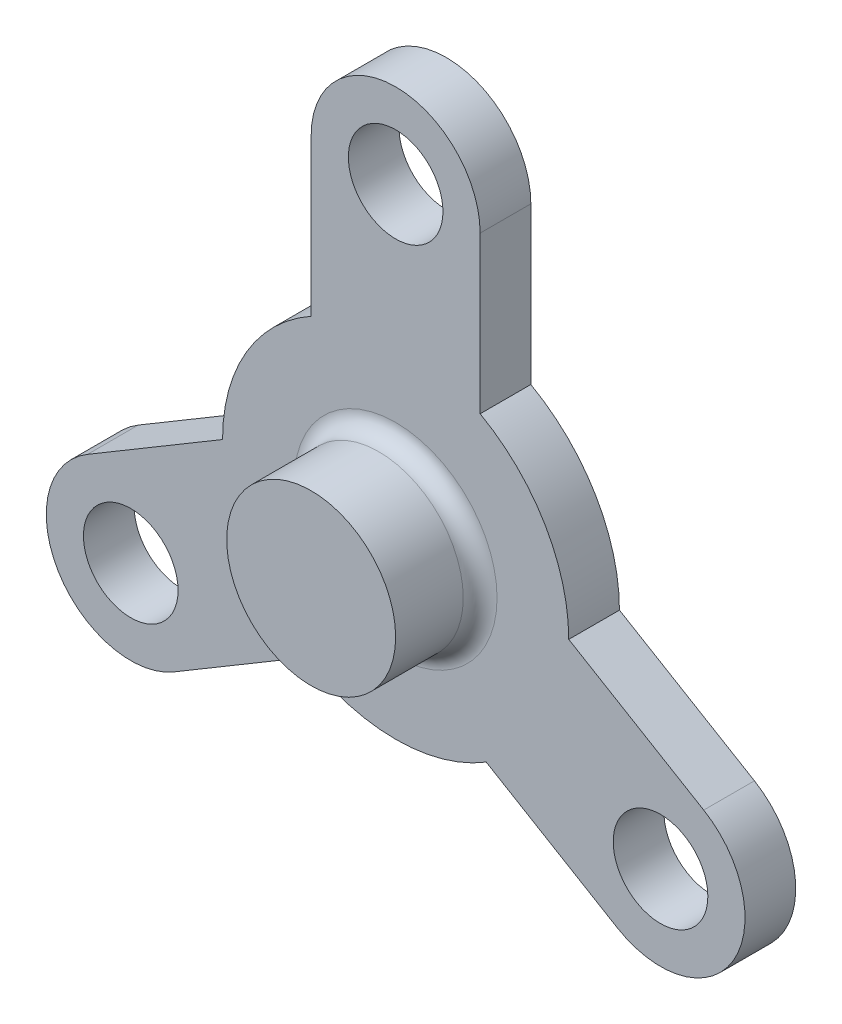
ISO-10303-21;
HEADER;
FILE_DESCRIPTION(('STEP AP214'),'2;1');
FILE_NAME('part.step','',(''),(''),'','','');
FILE_SCHEMA(('AUTOMOTIVE_DESIGN { 1 0 10303 214 1 1 1 1 }'));
ENDSEC;
DATA;
#1=APPLICATION_CONTEXT('core data for automotive mechanical design processes');
#2=APPLICATION_PROTOCOL_DEFINITION('international standard','automotive_design',2000,#1);
#3=PRODUCT_CONTEXT('',#1,'mechanical');
#4=PRODUCT('Part','Part','',(#3));
#5=PRODUCT_RELATED_PRODUCT_CATEGORY('part','',(#4));
#6=PRODUCT_DEFINITION_FORMATION('','',#4);
#7=PRODUCT_DEFINITION_CONTEXT('part definition',#1,'design');
#8=PRODUCT_DEFINITION('design','',#6,#7);
#9=PRODUCT_DEFINITION_SHAPE('','',#8);
#10=(LENGTH_UNIT() NAMED_UNIT(*) SI_UNIT(.MILLI.,.METRE.));
#11=(NAMED_UNIT(*) PLANE_ANGLE_UNIT() SI_UNIT($,.RADIAN.));
#12=(NAMED_UNIT(*) SI_UNIT($,.STERADIAN.) SOLID_ANGLE_UNIT());
#13=UNCERTAINTY_MEASURE_WITH_UNIT(LENGTH_MEASURE(1.E-05),#10,'distance_accuracy_value','');
#14=(GEOMETRIC_REPRESENTATION_CONTEXT(3) GLOBAL_UNCERTAINTY_ASSIGNED_CONTEXT((#13)) GLOBAL_UNIT_ASSIGNED_CONTEXT((#10,
#11,#12)) REPRESENTATION_CONTEXT('',''));
#15=CARTESIAN_POINT('',(0.,0.,0.));
#16=DIRECTION('',(0.,0.,1.));
#17=DIRECTION('',(1.,0.,0.));
#18=AXIS2_PLACEMENT_3D('',#15,#16,#17);
#19=CARTESIAN_POINT('',(-15.6750598084983,-9.05000000000008,3.));
#20=DIRECTION('',(0.,0.,-1.));
#21=DIRECTION('',(-1.,0.,0.));
#22=AXIS2_PLACEMENT_3D('',#19,#20,#21);
#23=CYLINDRICAL_SURFACE('',#22,5.);
#24=CARTESIAN_POINT('',(-15.6750598084983,-9.05000000000008,0.));
#25=DIRECTION('',(0.,0.,1.));
#26=DIRECTION('',(1.,0.,0.));
#27=AXIS2_PLACEMENT_3D('',#24,#25,#26);
#28=CIRCLE('',#27,5.);
#29=CARTESIAN_POINT('',(-18.2317713929619,-4.75311439832654,0.));
#30=VERTEX_POINT('',#29);
#31=CARTESIAN_POINT('',(-13.1183482240346,-13.3468856016736,0.));
#32=VERTEX_POINT('',#31);
#33=EDGE_CURVE('E198',#30,#32,#28,.T.);
#34=ORIENTED_EDGE('',*,*,#33,.T.);
#35=DIRECTION('',(0.,0.,-1.));
#36=VECTOR('',#35,1.);
#37=CARTESIAN_POINT('',(-13.1183482240346,-13.3468856016736,3.));
#38=LINE('',#37,#36);
#39=CARTESIAN_POINT('',(-13.1183482240346,-13.3468856016736,3.));
#40=VERTEX_POINT('',#39);
#41=EDGE_CURVE('E235',#40,#32,#38,.T.);
#42=ORIENTED_EDGE('',*,*,#41,.F.);
#43=CARTESIAN_POINT('',(-15.6750598084983,-9.05000000000008,3.));
#44=DIRECTION('',(0.,0.,1.));
#45=DIRECTION('',(1.,0.,0.));
#46=AXIS2_PLACEMENT_3D('',#43,#44,#45);
#47=CIRCLE('',#46,5.);
#48=CARTESIAN_POINT('',(-18.2317713929619,-4.75311439832654,3.));
#49=VERTEX_POINT('',#48);
#50=EDGE_CURVE('E310',#49,#40,#47,.T.);
#51=ORIENTED_EDGE('',*,*,#50,.F.);
#52=DIRECTION('',(0.,0.,-1.));
#53=VECTOR('',#52,1.);
#54=CARTESIAN_POINT('',(-18.2317713929619,-4.75311439832654,3.));
#55=LINE('',#54,#53);
#56=EDGE_CURVE('E144',#49,#30,#55,.T.);
#57=ORIENTED_EDGE('',*,*,#56,.T.);
#58=EDGE_LOOP('',(#34,#42,#51,#57));
#59=FACE_BOUND('',#58,.T.);
#60=ADVANCED_FACE('F74',(#59),#23,.T.);
#61=CARTESIAN_POINT('',(2.43503335375282,-4.09238954480285,3.));
#62=DIRECTION('',(-0.511342316892728,0.859377120334709,0.));
#63=DIRECTION('',(-0.859377120334709,-0.511342316892728,0.));
#64=AXIS2_PLACEMENT_3D('',#61,#62,#63);
#65=PLANE('',#64);
#66=DIRECTION('',(0.859377120334709,0.511342316892728,0.));
#67=VECTOR('',#66,1.);
#68=CARTESIAN_POINT('',(2.43503335375282,-4.09238954480285,0.));
#69=LINE('',#68,#67);
#70=CARTESIAN_POINT('',(-5.35896242928677,-8.72993430512808,0.));
#71=VERTEX_POINT('',#70);
#72=EDGE_CURVE('E201',#32,#71,#69,.T.);
#73=ORIENTED_EDGE('',*,*,#72,.T.);
#74=DIRECTION('',(0.,0.,-1.));
#75=VECTOR('',#74,1.);
#76=CARTESIAN_POINT('',(-5.35896242928677,-8.72993430512808,3.));
#77=LINE('',#76,#75);
#78=CARTESIAN_POINT('',(-5.35896242928677,-8.72993430512808,3.));
#79=VERTEX_POINT('',#78);
#80=EDGE_CURVE('E232',#79,#71,#77,.T.);
#81=ORIENTED_EDGE('',*,*,#80,.F.);
#82=DIRECTION('',(0.859377120334709,0.511342316892728,0.));
#83=VECTOR('',#82,1.);
#84=CARTESIAN_POINT('',(2.43503335375282,-4.09238954480285,3.));
#85=LINE('',#84,#83);
#86=EDGE_CURVE('E309',#40,#79,#85,.T.);
#87=ORIENTED_EDGE('',*,*,#86,.F.);
#88=ORIENTED_EDGE('',*,*,#41,.T.);
#89=EDGE_LOOP('',(#73,#81,#87,#88));
#90=FACE_BOUND('',#89,.T.);
#91=ADVANCED_FACE('F260',(#90),#65,.F.);
#92=CARTESIAN_POINT('',(0.,0.,3.));
#93=DIRECTION('',(0.,0.,-1.));
#94=DIRECTION('',(-1.,0.,0.));
#95=AXIS2_PLACEMENT_3D('',#92,#93,#94);
#96=CYLINDRICAL_SURFACE('',#95,10.2435458358109);
#97=CARTESIAN_POINT('',(0.,0.,0.));
#98=DIRECTION('',(0.,0.,1.));
#99=DIRECTION('',(1.,0.,0.));
#100=AXIS2_PLACEMENT_3D('',#97,#98,#99);
#101=CIRCLE('',#100,10.2435458358109);
#102=CARTESIAN_POINT('',(5.35896242928677,-8.72993430512809,0.));
#103=VERTEX_POINT('',#102);
#104=EDGE_CURVE('E203',#71,#103,#101,.T.);
#105=ORIENTED_EDGE('',*,*,#104,.T.);
#106=DIRECTION('',(0.,0.,-1.));
#107=VECTOR('',#106,1.);
#108=CARTESIAN_POINT('',(5.35896242928677,-8.72993430512809,3.));
#109=LINE('',#108,#107);
#110=CARTESIAN_POINT('',(5.35896242928677,-8.72993430512809,3.));
#111=VERTEX_POINT('',#110);
#112=EDGE_CURVE('E230',#111,#103,#109,.T.);
#113=ORIENTED_EDGE('',*,*,#112,.F.);
#114=CARTESIAN_POINT('',(0.,0.,3.));
#115=DIRECTION('',(0.,0.,1.));
#116=DIRECTION('',(1.,0.,0.));
#117=AXIS2_PLACEMENT_3D('',#114,#115,#116);
#118=CIRCLE('',#117,10.2435458358109);
#119=EDGE_CURVE('E192',#79,#111,#118,.T.);
#120=ORIENTED_EDGE('',*,*,#119,.F.);
#121=ORIENTED_EDGE('',*,*,#80,.T.);
#122=EDGE_LOOP('',(#105,#113,#120,#121));
#123=FACE_BOUND('',#122,.T.);
#124=ADVANCED_FACE('F266',(#123),#96,.T.);
#125=CARTESIAN_POINT('',(-2.43503335375282,-4.09238954480286,3.));
#126=DIRECTION('',(-0.511342316892728,-0.859377120334709,0.));
#127=DIRECTION('',(0.859377120334709,-0.511342316892728,0.));
#128=AXIS2_PLACEMENT_3D('',#125,#126,#127);
#129=PLANE('',#128);
#130=DIRECTION('',(-0.859377120334709,0.511342316892728,0.));
#131=VECTOR('',#130,1.);
#132=CARTESIAN_POINT('',(-2.43503335375282,-4.09238954480286,0.));
#133=LINE('',#132,#131);
#134=CARTESIAN_POINT('',(13.1183482240346,-13.3468856016736,0.));
#135=VERTEX_POINT('',#134);
#136=EDGE_CURVE('E206',#135,#103,#133,.T.);
#137=ORIENTED_EDGE('',*,*,#136,.F.);
#138=DIRECTION('',(0.,0.,-1.));
#139=VECTOR('',#138,1.);
#140=CARTESIAN_POINT('',(13.1183482240346,-13.3468856016736,3.));
#141=LINE('',#140,#139);
#142=CARTESIAN_POINT('',(13.1183482240346,-13.3468856016736,3.));
#143=VERTEX_POINT('',#142);
#144=EDGE_CURVE('E228',#143,#135,#141,.T.);
#145=ORIENTED_EDGE('',*,*,#144,.F.);
#146=DIRECTION('',(-0.859377120334709,0.511342316892728,0.));
#147=VECTOR('',#146,1.);
#148=CARTESIAN_POINT('',(-2.43503335375282,-4.09238954480286,3.));
#149=LINE('',#148,#147);
#150=EDGE_CURVE('E301',#143,#111,#149,.T.);
#151=ORIENTED_EDGE('',*,*,#150,.T.);
#152=ORIENTED_EDGE('',*,*,#112,.T.);
#153=EDGE_LOOP('',(#137,#145,#151,#152));
#154=FACE_BOUND('',#153,.T.);
#155=ADVANCED_FACE('F299',(#154),#129,.T.);
#156=CARTESIAN_POINT('',(2.67838981517445,4.50138165854423,3.));
#157=DIRECTION('',(-0.511342316892728,-0.859377120334709,0.));
#158=DIRECTION('',(0.859377120334709,-0.511342316892728,0.));
#159=AXIS2_PLACEMENT_3D('',#156,#157,#158);
#160=PLANE('',#159);
#161=DIRECTION('',(-0.859377120334709,0.511342316892728,0.));
#162=VECTOR('',#161,1.);
#163=CARTESIAN_POINT('',(2.67838981517445,4.50138165854423,0.));
#164=LINE('',#163,#162);
#165=CARTESIAN_POINT('',(18.2317713929619,-4.75311439832654,0.));
#166=VERTEX_POINT('',#165);
#167=CARTESIAN_POINT('',(10.2435458358109,0.,0.));
#168=VERTEX_POINT('',#167);
#169=EDGE_CURVE('E211',#166,#168,#164,.T.);
#170=ORIENTED_EDGE('',*,*,#169,.T.);
#171=DIRECTION('',(0.,0.,-1.));
#172=VECTOR('',#171,1.);
#173=CARTESIAN_POINT('',(10.2435458358109,0.,3.));
#174=LINE('',#173,#172);
#175=CARTESIAN_POINT('',(10.2435458358109,0.,3.));
#176=VERTEX_POINT('',#175);
#177=EDGE_CURVE('E223',#176,#168,#174,.T.);
#178=ORIENTED_EDGE('',*,*,#177,.F.);
#179=DIRECTION('',(-0.859377120334709,0.511342316892728,0.));
#180=VECTOR('',#179,1.);
#181=CARTESIAN_POINT('',(2.67838981517445,4.50138165854423,3.));
#182=LINE('',#181,#180);
#183=CARTESIAN_POINT('',(18.2317713929619,-4.75311439832654,3.));
#184=VERTEX_POINT('',#183);
#185=EDGE_CURVE('E319',#184,#176,#182,.T.);
#186=ORIENTED_EDGE('',*,*,#185,.F.);
#187=DIRECTION('',(0.,0.,-1.));
#188=VECTOR('',#187,1.);
#189=CARTESIAN_POINT('',(18.2317713929619,-4.75311439832654,3.));
#190=LINE('',#189,#188);
#191=EDGE_CURVE('E226',#184,#166,#190,.T.);
#192=ORIENTED_EDGE('',*,*,#191,.T.);
#193=EDGE_LOOP('',(#170,#178,#186,#192));
#194=FACE_BOUND('',#193,.T.);
#195=ADVANCED_FACE('F341',(#194),#160,.F.);
#196=CARTESIAN_POINT('',(5.,8.94037086984423,0.));
#197=VERTEX_POINT('',#196);
#198=EDGE_CURVE('E208',#168,#197,#101,.T.);
#199=ORIENTED_EDGE('',*,*,#198,.T.);
#200=DIRECTION('',(0.,0.,-1.));
#201=VECTOR('',#200,1.);
#202=CARTESIAN_POINT('',(5.,8.94037086984423,3.));
#203=LINE('',#202,#201);
#204=CARTESIAN_POINT('',(5.,8.94037086984423,3.));
#205=VERTEX_POINT('',#204);
#206=EDGE_CURVE('E221',#205,#197,#203,.T.);
#207=ORIENTED_EDGE('',*,*,#206,.F.);
#208=EDGE_CURVE('E191',#176,#205,#118,.T.);
#209=ORIENTED_EDGE('',*,*,#208,.F.);
#210=ORIENTED_EDGE('',*,*,#177,.T.);
#211=EDGE_LOOP('',(#199,#207,#209,#210));
#212=FACE_BOUND('',#211,.T.);
#213=ADVANCED_FACE('F327',(#212),#96,.T.);
#214=CARTESIAN_POINT('',(5.,0.,3.));
#215=DIRECTION('',(1.,0.,0.));
#216=DIRECTION('',(0.,1.,0.));
#217=AXIS2_PLACEMENT_3D('',#214,#215,#216);
#218=PLANE('',#217);
#219=DIRECTION('',(0.,-1.,0.));
#220=VECTOR('',#219,1.);
#221=CARTESIAN_POINT('',(5.,0.,0.));
#222=LINE('',#221,#220);
#223=CARTESIAN_POINT('',(5.,18.2,0.));
#224=VERTEX_POINT('',#223);
#225=EDGE_CURVE('E213',#224,#197,#222,.T.);
#226=ORIENTED_EDGE('',*,*,#225,.F.);
#227=DIRECTION('',(0.,0.,-1.));
#228=VECTOR('',#227,1.);
#229=CARTESIAN_POINT('',(5.,18.2,3.));
#230=LINE('',#229,#228);
#231=CARTESIAN_POINT('',(5.,18.2,3.));
#232=VERTEX_POINT('',#231);
#233=EDGE_CURVE('E185',#232,#224,#230,.T.);
#234=ORIENTED_EDGE('',*,*,#233,.F.);
#235=DIRECTION('',(0.,-1.,0.));
#236=VECTOR('',#235,1.);
#237=CARTESIAN_POINT('',(5.,0.,3.));
#238=LINE('',#237,#236);
#239=EDGE_CURVE('E178',#232,#205,#238,.T.);
#240=ORIENTED_EDGE('',*,*,#239,.T.);
#241=ORIENTED_EDGE('',*,*,#206,.T.);
#242=EDGE_LOOP('',(#226,#234,#240,#241));
#243=FACE_BOUND('',#242,.T.);
#244=ADVANCED_FACE('F329',(#243),#218,.T.);
#245=CARTESIAN_POINT('',(0.,18.2,3.));
#246=DIRECTION('',(0.,0.,-1.));
#247=DIRECTION('',(-1.,0.,0.));
#248=AXIS2_PLACEMENT_3D('',#245,#246,#247);
#249=CYLINDRICAL_SURFACE('',#248,5.);
#250=CARTESIAN_POINT('',(0.,18.2,0.));
#251=DIRECTION('',(0.,0.,1.));
#252=DIRECTION('',(1.,0.,0.));
#253=AXIS2_PLACEMENT_3D('',#250,#251,#252);
#254=CIRCLE('',#253,5.);
#255=CARTESIAN_POINT('',(-5.,18.2,0.));
#256=VERTEX_POINT('',#255);
#257=EDGE_CURVE('E184',#224,#256,#254,.T.);
#258=ORIENTED_EDGE('',*,*,#257,.T.);
#259=DIRECTION('',(0.,0.,-1.));
#260=VECTOR('',#259,1.);
#261=CARTESIAN_POINT('',(-5.,18.2,3.));
#262=LINE('',#261,#260);
#263=CARTESIAN_POINT('',(-5.,18.2,3.));
#264=VERTEX_POINT('',#263);
#265=EDGE_CURVE('E181',#264,#256,#262,.T.);
#266=ORIENTED_EDGE('',*,*,#265,.F.);
#267=CARTESIAN_POINT('',(0.,18.2,3.));
#268=DIRECTION('',(0.,0.,1.));
#269=DIRECTION('',(1.,0.,0.));
#270=AXIS2_PLACEMENT_3D('',#267,#268,#269);
#271=CIRCLE('',#270,5.);
#272=EDGE_CURVE('E172',#232,#264,#271,.T.);
#273=ORIENTED_EDGE('',*,*,#272,.F.);
#274=ORIENTED_EDGE('',*,*,#233,.T.);
#275=EDGE_LOOP('',(#258,#266,#273,#274));
#276=FACE_BOUND('',#275,.T.);
#277=ADVANCED_FACE('F182',(#276),#249,.T.);
#278=CARTESIAN_POINT('',(-5.,0.,3.));
#279=DIRECTION('',(1.,0.,0.));
#280=DIRECTION('',(0.,1.,0.));
#281=AXIS2_PLACEMENT_3D('',#278,#279,#280);
#282=PLANE('',#281);
#283=DIRECTION('',(0.,-1.,0.));
#284=VECTOR('',#283,1.);
#285=CARTESIAN_POINT('',(-5.,0.,0.));
#286=LINE('',#285,#284);
#287=CARTESIAN_POINT('',(-5.,8.94037086984424,0.));
#288=VERTEX_POINT('',#287);
#289=EDGE_CURVE('E132',#256,#288,#286,.T.);
#290=ORIENTED_EDGE('',*,*,#289,.T.);
#291=DIRECTION('',(0.,0.,-1.));
#292=VECTOR('',#291,1.);
#293=CARTESIAN_POINT('',(-5.,8.94037086984424,3.));
#294=LINE('',#293,#292);
#295=CARTESIAN_POINT('',(-5.,8.94037086984424,3.));
#296=VERTEX_POINT('',#295);
#297=EDGE_CURVE('E186',#296,#288,#294,.T.);
#298=ORIENTED_EDGE('',*,*,#297,.F.);
#299=DIRECTION('',(0.,-1.,0.));
#300=VECTOR('',#299,1.);
#301=CARTESIAN_POINT('',(-5.,0.,3.));
#302=LINE('',#301,#300);
#303=EDGE_CURVE('E176',#264,#296,#302,.T.);
#304=ORIENTED_EDGE('',*,*,#303,.F.);
#305=ORIENTED_EDGE('',*,*,#265,.T.);
#306=EDGE_LOOP('',(#290,#298,#304,#305));
#307=FACE_BOUND('',#306,.T.);
#308=ADVANCED_FACE('F188',(#307),#282,.F.);
#309=CARTESIAN_POINT('',(-10.2435458358109,0.,0.));
#310=VERTEX_POINT('',#309);
#311=EDGE_CURVE('E207',#288,#310,#101,.T.);
#312=ORIENTED_EDGE('',*,*,#311,.T.);
#313=DIRECTION('',(0.,0.,-1.));
#314=VECTOR('',#313,1.);
#315=CARTESIAN_POINT('',(-10.2435458358109,0.,3.));
#316=LINE('',#315,#314);
#317=CARTESIAN_POINT('',(-10.2435458358109,0.,3.));
#318=VERTEX_POINT('',#317);
#319=EDGE_CURVE('E139',#318,#310,#316,.T.);
#320=ORIENTED_EDGE('',*,*,#319,.F.);
#321=EDGE_CURVE('E91',#296,#318,#118,.T.);
#322=ORIENTED_EDGE('',*,*,#321,.F.);
#323=ORIENTED_EDGE('',*,*,#297,.T.);
#324=EDGE_LOOP('',(#312,#320,#322,#323));
#325=FACE_BOUND('',#324,.T.);
#326=ADVANCED_FACE('F274',(#325),#96,.T.);
#327=CARTESIAN_POINT('',(-2.67838981517446,4.50138165854424,3.));
#328=DIRECTION('',(-0.511342316892728,0.859377120334709,0.));
#329=DIRECTION('',(-0.859377120334709,-0.511342316892728,0.));
#330=AXIS2_PLACEMENT_3D('',#327,#328,#329);
#331=PLANE('',#330);
#332=DIRECTION('',(0.859377120334709,0.511342316892728,0.));
#333=VECTOR('',#332,1.);
#334=CARTESIAN_POINT('',(-2.67838981517446,4.50138165854424,0.));
#335=LINE('',#334,#333);
#336=EDGE_CURVE('E195',#30,#310,#335,.T.);
#337=ORIENTED_EDGE('',*,*,#336,.F.);
#338=ORIENTED_EDGE('',*,*,#56,.F.);
#339=DIRECTION('',(0.859377120334709,0.511342316892728,0.));
#340=VECTOR('',#339,1.);
#341=CARTESIAN_POINT('',(-2.67838981517446,4.50138165854424,3.));
#342=LINE('',#341,#340);
#343=EDGE_CURVE('E311',#49,#318,#342,.T.);
#344=ORIENTED_EDGE('',*,*,#343,.T.);
#345=ORIENTED_EDGE('',*,*,#319,.T.);
#346=EDGE_LOOP('',(#337,#338,#344,#345));
#347=FACE_BOUND('',#346,.T.);
#348=ADVANCED_FACE('F271',(#347),#331,.T.);
#349=CARTESIAN_POINT('',(0.,0.,0.));
#350=DIRECTION('',(0.,0.,1.));
#351=DIRECTION('',(1.,0.,0.));
#352=AXIS2_PLACEMENT_3D('',#349,#350,#351);
#353=PLANE('',#352);
#354=CARTESIAN_POINT('',(0.,18.2,0.));
#355=DIRECTION('',(0.,0.,1.));
#356=DIRECTION('',(1.,0.,0.));
#357=AXIS2_PLACEMENT_3D('',#354,#355,#356);
#358=CIRCLE('',#357,2.8);
#359=CARTESIAN_POINT('',(2.8,18.2,0.));
#360=VERTEX_POINT('',#359);
#361=EDGE_CURVE('E243',#360,#360,#358,.T.);
#362=ORIENTED_EDGE('',*,*,#361,.T.);
#363=EDGE_LOOP('',(#362));
#364=FACE_BOUND('',#363,.T.);
#365=CARTESIAN_POINT('',(15.6750598084983,-9.05000000000008,0.));
#366=DIRECTION('',(0.,0.,1.));
#367=DIRECTION('',(1.,0.,0.));
#368=AXIS2_PLACEMENT_3D('',#365,#366,#367);
#369=CIRCLE('',#368,2.8);
#370=CARTESIAN_POINT('',(18.4750598084983,-9.05000000000008,0.));
#371=VERTEX_POINT('',#370);
#372=EDGE_CURVE('E459',#371,#371,#369,.T.);
#373=ORIENTED_EDGE('',*,*,#372,.T.);
#374=EDGE_LOOP('',(#373));
#375=FACE_BOUND('',#374,.T.);
#376=CARTESIAN_POINT('',(-15.6750598084983,-9.05000000000008,0.));
#377=DIRECTION('',(0.,0.,1.));
#378=DIRECTION('',(1.,0.,0.));
#379=AXIS2_PLACEMENT_3D('',#376,#377,#378);
#380=CIRCLE('',#379,2.8);
#381=CARTESIAN_POINT('',(-12.8750598084983,-9.05000000000008,0.));
#382=VERTEX_POINT('',#381);
#383=EDGE_CURVE('E461',#382,#382,#380,.T.);
#384=ORIENTED_EDGE('',*,*,#383,.T.);
#385=EDGE_LOOP('',(#384));
#386=FACE_BOUND('',#385,.T.);
#387=ORIENTED_EDGE('',*,*,#336,.T.);
#388=ORIENTED_EDGE('',*,*,#311,.F.);
#389=ORIENTED_EDGE('',*,*,#289,.F.);
#390=ORIENTED_EDGE('',*,*,#257,.F.);
#391=ORIENTED_EDGE('',*,*,#225,.T.);
#392=ORIENTED_EDGE('',*,*,#198,.F.);
#393=ORIENTED_EDGE('',*,*,#169,.F.);
#394=CARTESIAN_POINT('',(15.6750598084983,-9.05000000000008,0.));
#395=DIRECTION('',(0.,0.,1.));
#396=DIRECTION('',(1.,0.,0.));
#397=AXIS2_PLACEMENT_3D('',#394,#395,#396);
#398=CIRCLE('',#397,5.);
#399=EDGE_CURVE('E241',#135,#166,#398,.T.);
#400=ORIENTED_EDGE('',*,*,#399,.F.);
#401=ORIENTED_EDGE('',*,*,#136,.T.);
#402=ORIENTED_EDGE('',*,*,#104,.F.);
#403=ORIENTED_EDGE('',*,*,#72,.F.);
#404=ORIENTED_EDGE('',*,*,#33,.F.);
#405=EDGE_LOOP('',(#387,#388,#389,#390,#391,#392,#393,#400,#401,#402,#403,#404));
#406=FACE_BOUND('',#405,.T.);
#407=ADVANCED_FACE('F273',(#364,#375,#386,#406),#353,.F.);
#408=CARTESIAN_POINT('',(0.,0.,3.));
#409=DIRECTION('',(0.,0.,1.));
#410=DIRECTION('',(1.,0.,0.));
#411=AXIS2_PLACEMENT_3D('',#408,#409,#410);
#412=PLANE('',#411);
#413=CARTESIAN_POINT('',(0.,0.,3.));
#414=DIRECTION('',(0.,0.,1.));
#415=DIRECTION('',(1.,0.,0.));
#416=AXIS2_PLACEMENT_3D('',#413,#414,#415);
#417=CIRCLE('',#416,6.);
#418=CARTESIAN_POINT('',(6.,0.,3.));
#419=VERTEX_POINT('',#418);
#420=EDGE_CURVE('E12',#419,#419,#417,.F.);
#421=ORIENTED_EDGE('',*,*,#420,.T.);
#422=EDGE_LOOP('',(#421));
#423=FACE_BOUND('',#422,.T.);
#424=CARTESIAN_POINT('',(0.,18.2,3.));
#425=DIRECTION('',(0.,0.,1.));
#426=DIRECTION('',(1.,0.,0.));
#427=AXIS2_PLACEMENT_3D('',#424,#425,#426);
#428=CIRCLE('',#427,2.8);
#429=CARTESIAN_POINT('',(2.8,18.2,3.));
#430=VERTEX_POINT('',#429);
#431=EDGE_CURVE('E456',#430,#430,#428,.T.);
#432=ORIENTED_EDGE('',*,*,#431,.F.);
#433=EDGE_LOOP('',(#432));
#434=FACE_BOUND('',#433,.T.);
#435=CARTESIAN_POINT('',(15.6750598084983,-9.05000000000008,3.));
#436=DIRECTION('',(0.,0.,1.));
#437=DIRECTION('',(1.,0.,0.));
#438=AXIS2_PLACEMENT_3D('',#435,#436,#437);
#439=CIRCLE('',#438,2.8);
#440=CARTESIAN_POINT('',(18.4750598084983,-9.05000000000008,3.));
#441=VERTEX_POINT('',#440);
#442=EDGE_CURVE('E470',#441,#441,#439,.T.);
#443=ORIENTED_EDGE('',*,*,#442,.F.);
#444=EDGE_LOOP('',(#443));
#445=FACE_BOUND('',#444,.T.);
#446=CARTESIAN_POINT('',(-15.6750598084983,-9.05000000000008,3.));
#447=DIRECTION('',(0.,0.,1.));
#448=DIRECTION('',(1.,0.,0.));
#449=AXIS2_PLACEMENT_3D('',#446,#447,#448);
#450=CIRCLE('',#449,2.8);
#451=CARTESIAN_POINT('',(-12.8750598084983,-9.05000000000008,3.));
#452=VERTEX_POINT('',#451);
#453=EDGE_CURVE('E467',#452,#452,#450,.T.);
#454=ORIENTED_EDGE('',*,*,#453,.F.);
#455=EDGE_LOOP('',(#454));
#456=FACE_BOUND('',#455,.T.);
#457=ORIENTED_EDGE('',*,*,#343,.F.);
#458=ORIENTED_EDGE('',*,*,#50,.T.);
#459=ORIENTED_EDGE('',*,*,#86,.T.);
#460=ORIENTED_EDGE('',*,*,#119,.T.);
#461=ORIENTED_EDGE('',*,*,#150,.F.);
#462=CARTESIAN_POINT('',(15.6750598084983,-9.05000000000008,3.));
#463=DIRECTION('',(0.,0.,1.));
#464=DIRECTION('',(1.,0.,0.));
#465=AXIS2_PLACEMENT_3D('',#462,#463,#464);
#466=CIRCLE('',#465,5.);
#467=EDGE_CURVE('E199',#143,#184,#466,.T.);
#468=ORIENTED_EDGE('',*,*,#467,.T.);
#469=ORIENTED_EDGE('',*,*,#185,.T.);
#470=ORIENTED_EDGE('',*,*,#208,.T.);
#471=ORIENTED_EDGE('',*,*,#239,.F.);
#472=ORIENTED_EDGE('',*,*,#272,.T.);
#473=ORIENTED_EDGE('',*,*,#303,.T.);
#474=ORIENTED_EDGE('',*,*,#321,.T.);
#475=EDGE_LOOP('',(#457,#458,#459,#460,#461,#468,#469,#470,#471,#472,#473,#474));
#476=FACE_BOUND('',#475,.T.);
#477=ADVANCED_FACE('F174',(#423,#434,#445,#456,#476),#412,.T.);
#478=CARTESIAN_POINT('',(15.6750598084983,-9.05000000000008,3.));
#479=DIRECTION('',(0.,0.,-1.));
#480=DIRECTION('',(-1.,0.,0.));
#481=AXIS2_PLACEMENT_3D('',#478,#479,#480);
#482=CYLINDRICAL_SURFACE('',#481,5.);
#483=ORIENTED_EDGE('',*,*,#144,.T.);
#484=ORIENTED_EDGE('',*,*,#399,.T.);
#485=ORIENTED_EDGE('',*,*,#191,.F.);
#486=ORIENTED_EDGE('',*,*,#467,.F.);
#487=EDGE_LOOP('',(#483,#484,#485,#486));
#488=FACE_BOUND('',#487,.T.);
#489=ADVANCED_FACE('F275',(#488),#482,.T.);
#490=CARTESIAN_POINT('',(-15.6750598084983,-9.05000000000008,-2.5));
#491=DIRECTION('',(0.,0.,1.));
#492=DIRECTION('',(1.,0.,0.));
#493=AXIS2_PLACEMENT_3D('',#490,#491,#492);
#494=CYLINDRICAL_SURFACE('',#493,2.8);
#495=ORIENTED_EDGE('',*,*,#453,.T.);
#496=EDGE_LOOP('',(#495));
#497=FACE_BOUND('',#496,.T.);
#498=ORIENTED_EDGE('',*,*,#383,.F.);
#499=EDGE_LOOP('',(#498));
#500=FACE_BOUND('',#499,.T.);
#501=ADVANCED_FACE('F277',(#497,#500),#494,.F.);
#502=CARTESIAN_POINT('',(15.6750598084983,-9.05000000000008,-2.5));
#503=DIRECTION('',(0.,0.,1.));
#504=DIRECTION('',(1.,0.,0.));
#505=AXIS2_PLACEMENT_3D('',#502,#503,#504);
#506=CYLINDRICAL_SURFACE('',#505,2.8);
#507=ORIENTED_EDGE('',*,*,#442,.T.);
#508=EDGE_LOOP('',(#507));
#509=FACE_BOUND('',#508,.T.);
#510=ORIENTED_EDGE('',*,*,#372,.F.);
#511=EDGE_LOOP('',(#510));
#512=FACE_BOUND('',#511,.T.);
#513=ADVANCED_FACE('F283',(#509,#512),#506,.F.);
#514=CARTESIAN_POINT('',(0.,18.2,-2.5));
#515=DIRECTION('',(0.,0.,1.));
#516=DIRECTION('',(1.,0.,0.));
#517=AXIS2_PLACEMENT_3D('',#514,#515,#516);
#518=CYLINDRICAL_SURFACE('',#517,2.8);
#519=ORIENTED_EDGE('',*,*,#431,.T.);
#520=EDGE_LOOP('',(#519));
#521=FACE_BOUND('',#520,.T.);
#522=ORIENTED_EDGE('',*,*,#361,.F.);
#523=EDGE_LOOP('',(#522));
#524=FACE_BOUND('',#523,.T.);
#525=ADVANCED_FACE('F403',(#521,#524),#518,.F.);
#526=CARTESIAN_POINT('',(0.,0.,8.));
#527=DIRECTION('',(0.,0.,-1.));
#528=DIRECTION('',(-1.,0.,0.));
#529=AXIS2_PLACEMENT_3D('',#526,#527,#528);
#530=CYLINDRICAL_SURFACE('',#529,5.);
#531=CARTESIAN_POINT('',(0.,0.,4.));
#532=DIRECTION('',(0.,0.,1.));
#533=DIRECTION('',(1.,0.,0.));
#534=AXIS2_PLACEMENT_3D('',#531,#532,#533);
#535=CIRCLE('',#534,5.);
#536=CARTESIAN_POINT('',(5.,0.,4.));
#537=VERTEX_POINT('',#536);
#538=EDGE_CURVE('E83',#537,#537,#535,.T.);
#539=ORIENTED_EDGE('',*,*,#538,.T.);
#540=EDGE_LOOP('',(#539));
#541=FACE_BOUND('',#540,.T.);
#542=CARTESIAN_POINT('',(0.,0.,8.));
#543=DIRECTION('',(0.,0.,1.));
#544=DIRECTION('',(1.,0.,0.));
#545=AXIS2_PLACEMENT_3D('',#542,#543,#544);
#546=CIRCLE('',#545,5.);
#547=CARTESIAN_POINT('',(5.,0.,8.));
#548=VERTEX_POINT('',#547);
#549=EDGE_CURVE('E471',#548,#548,#546,.T.);
#550=ORIENTED_EDGE('',*,*,#549,.F.);
#551=EDGE_LOOP('',(#550));
#552=FACE_BOUND('',#551,.T.);
#553=ADVANCED_FACE('F247',(#541,#552),#530,.T.);
#554=CARTESIAN_POINT('',(0.,0.,8.));
#555=DIRECTION('',(0.,0.,1.));
#556=DIRECTION('',(1.,0.,0.));
#557=AXIS2_PLACEMENT_3D('',#554,#555,#556);
#558=PLANE('',#557);
#559=ORIENTED_EDGE('',*,*,#549,.T.);
#560=EDGE_LOOP('',(#559));
#561=FACE_BOUND('',#560,.T.);
#562=ADVANCED_FACE('F251',(#561),#558,.T.);
#563=CARTESIAN_POINT('',(0.,0.,4.));
#564=DIRECTION('',(0.,0.,1.));
#565=DIRECTION('',(1.,0.,0.));
#566=AXIS2_PLACEMENT_3D('',#563,#564,#565);
#567=TOROIDAL_SURFACE('',#566,6.,1.);
#568=ORIENTED_EDGE('',*,*,#420,.F.);
#569=EDGE_LOOP('',(#568));
#570=FACE_BOUND('',#569,.T.);
#571=ORIENTED_EDGE('',*,*,#538,.F.);
#572=EDGE_LOOP('',(#571));
#573=FACE_BOUND('',#572,.T.);
#574=ADVANCED_FACE('F76',(#570,#573),#567,.F.);
#575=CLOSED_SHELL('',(#60,#91,#124,#155,#195,#213,#244,#277,#308,#326,#348,#407,#477,#489,#501,
#513,#525,#553,#562,#574));
#576=MANIFOLD_SOLID_BREP('B2',#575);
#577=ADVANCED_BREP_SHAPE_REPRESENTATION('',(#18,#576),#14);
#578=SHAPE_DEFINITION_REPRESENTATION(#9,#577);
ENDSEC;
END-ISO-10303-21;
